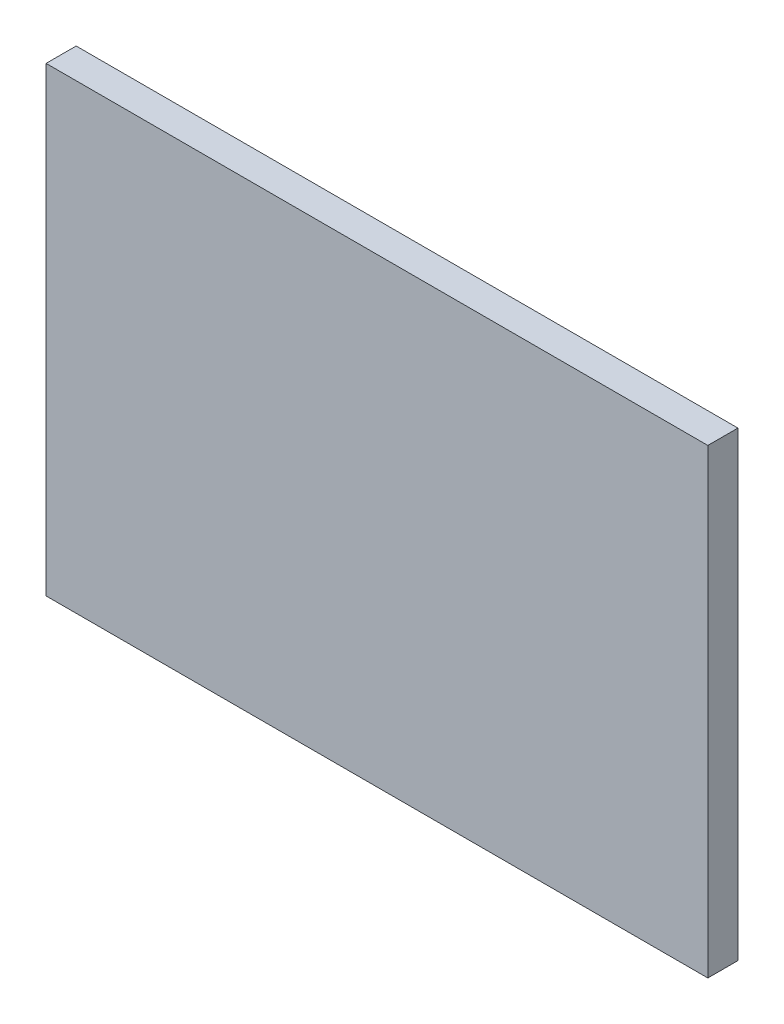
ISO-10303-21;
HEADER;
FILE_DESCRIPTION(('STEP AP214'),'2;1');
FILE_NAME('part.step','',(''),(''),'','','');
FILE_SCHEMA(('AUTOMOTIVE_DESIGN { 1 0 10303 214 1 1 1 1 }'));
ENDSEC;
DATA;
#1=APPLICATION_CONTEXT('core data for automotive mechanical design processes');
#2=APPLICATION_PROTOCOL_DEFINITION('international standard','automotive_design',2000,#1);
#3=PRODUCT_CONTEXT('',#1,'mechanical');
#4=PRODUCT('Part','Part','',(#3));
#5=PRODUCT_RELATED_PRODUCT_CATEGORY('part','',(#4));
#6=PRODUCT_DEFINITION_FORMATION('','',#4);
#7=PRODUCT_DEFINITION_CONTEXT('part definition',#1,'design');
#8=PRODUCT_DEFINITION('design','',#6,#7);
#9=PRODUCT_DEFINITION_SHAPE('','',#8);
#10=(LENGTH_UNIT() NAMED_UNIT(*) SI_UNIT(.MILLI.,.METRE.));
#11=(NAMED_UNIT(*) PLANE_ANGLE_UNIT() SI_UNIT($,.RADIAN.));
#12=(NAMED_UNIT(*) SI_UNIT($,.STERADIAN.) SOLID_ANGLE_UNIT());
#13=UNCERTAINTY_MEASURE_WITH_UNIT(LENGTH_MEASURE(1.E-05),#10,'distance_accuracy_value','');
#14=(GEOMETRIC_REPRESENTATION_CONTEXT(3) GLOBAL_UNCERTAINTY_ASSIGNED_CONTEXT((#13)) GLOBAL_UNIT_ASSIGNED_CONTEXT((#10,
#11,#12)) REPRESENTATION_CONTEXT('',''));
#15=CARTESIAN_POINT('',(0.,0.,0.));
#16=DIRECTION('',(0.,0.,1.));
#17=DIRECTION('',(1.,0.,0.));
#18=AXIS2_PLACEMENT_3D('',#15,#16,#17);
#19=CARTESIAN_POINT('',(32.9999999999999,23.,3.));
#20=DIRECTION('',(-1.,0.,0.));
#21=DIRECTION('',(0.,0.,1.));
#22=AXIS2_PLACEMENT_3D('',#19,#20,#21);
#23=PLANE('',#22);
#24=DIRECTION('',(0.,1.,0.));
#25=VECTOR('',#24,1.);
#26=CARTESIAN_POINT('',(32.9999999999999,23.,0.));
#27=LINE('',#26,#25);
#28=CARTESIAN_POINT('',(32.9999999999999,-23.,0.));
#29=VERTEX_POINT('',#28);
#30=CARTESIAN_POINT('',(32.9999999999999,23.,0.));
#31=VERTEX_POINT('',#30);
#32=EDGE_CURVE('E96',#29,#31,#27,.T.);
#33=ORIENTED_EDGE('',*,*,#32,.T.);
#34=DIRECTION('',(0.,0.,-1.));
#35=VECTOR('',#34,1.);
#36=CARTESIAN_POINT('',(32.9999999999999,23.,3.));
#37=LINE('',#36,#35);
#38=CARTESIAN_POINT('',(32.9999999999999,23.,3.));
#39=VERTEX_POINT('',#38);
#40=EDGE_CURVE('E11',#39,#31,#37,.T.);
#41=ORIENTED_EDGE('',*,*,#40,.F.);
#42=DIRECTION('',(0.,1.,0.));
#43=VECTOR('',#42,1.);
#44=CARTESIAN_POINT('',(32.9999999999999,23.,3.));
#45=LINE('',#44,#43);
#46=CARTESIAN_POINT('',(32.9999999999999,-23.,3.));
#47=VERTEX_POINT('',#46);
#48=EDGE_CURVE('E84',#47,#39,#45,.T.);
#49=ORIENTED_EDGE('',*,*,#48,.F.);
#50=DIRECTION('',(0.,0.,-1.));
#51=VECTOR('',#50,1.);
#52=CARTESIAN_POINT('',(32.9999999999999,-23.,3.));
#53=LINE('',#52,#51);
#54=EDGE_CURVE('E92',#47,#29,#53,.T.);
#55=ORIENTED_EDGE('',*,*,#54,.T.);
#56=EDGE_LOOP('',(#33,#41,#49,#55));
#57=FACE_BOUND('',#56,.T.);
#58=ADVANCED_FACE('F33',(#57),#23,.F.);
#59=CARTESIAN_POINT('',(-33.0000000000001,23.,3.));
#60=DIRECTION('',(0.,-1.,0.));
#61=DIRECTION('',(0.,0.,-1.));
#62=AXIS2_PLACEMENT_3D('',#59,#60,#61);
#63=PLANE('',#62);
#64=DIRECTION('',(-1.,0.,0.));
#65=VECTOR('',#64,1.);
#66=CARTESIAN_POINT('',(-33.0000000000001,23.,0.));
#67=LINE('',#66,#65);
#68=CARTESIAN_POINT('',(-33.0000000000001,23.,0.));
#69=VERTEX_POINT('',#68);
#70=EDGE_CURVE('E88',#31,#69,#67,.T.);
#71=ORIENTED_EDGE('',*,*,#70,.T.);
#72=DIRECTION('',(0.,0.,-1.));
#73=VECTOR('',#72,1.);
#74=CARTESIAN_POINT('',(-33.0000000000001,23.,3.));
#75=LINE('',#74,#73);
#76=CARTESIAN_POINT('',(-33.0000000000001,23.,3.));
#77=VERTEX_POINT('',#76);
#78=EDGE_CURVE('E41',#77,#69,#75,.T.);
#79=ORIENTED_EDGE('',*,*,#78,.F.);
#80=DIRECTION('',(-1.,0.,0.));
#81=VECTOR('',#80,1.);
#82=CARTESIAN_POINT('',(-33.0000000000001,23.,3.));
#83=LINE('',#82,#81);
#84=EDGE_CURVE('E79',#39,#77,#83,.T.);
#85=ORIENTED_EDGE('',*,*,#84,.F.);
#86=ORIENTED_EDGE('',*,*,#40,.T.);
#87=EDGE_LOOP('',(#71,#79,#85,#86));
#88=FACE_BOUND('',#87,.T.);
#89=ADVANCED_FACE('F87',(#88),#63,.F.);
#90=CARTESIAN_POINT('',(-33.0000000000001,23.,3.));
#91=DIRECTION('',(1.,0.,0.));
#92=DIRECTION('',(0.,0.,-1.));
#93=AXIS2_PLACEMENT_3D('',#90,#91,#92);
#94=PLANE('',#93);
#95=DIRECTION('',(0.,-1.,0.));
#96=VECTOR('',#95,1.);
#97=CARTESIAN_POINT('',(-33.0000000000001,23.,0.));
#98=LINE('',#97,#96);
#99=CARTESIAN_POINT('',(-33.0000000000001,-23.,0.));
#100=VERTEX_POINT('',#99);
#101=EDGE_CURVE('E66',#69,#100,#98,.T.);
#102=ORIENTED_EDGE('',*,*,#101,.T.);
#103=DIRECTION('',(0.,0.,-1.));
#104=VECTOR('',#103,1.);
#105=CARTESIAN_POINT('',(-33.0000000000001,-23.,3.));
#106=LINE('',#105,#104);
#107=CARTESIAN_POINT('',(-33.0000000000001,-23.,3.));
#108=VERTEX_POINT('',#107);
#109=EDGE_CURVE('E89',#108,#100,#106,.T.);
#110=ORIENTED_EDGE('',*,*,#109,.F.);
#111=DIRECTION('',(0.,-1.,0.));
#112=VECTOR('',#111,1.);
#113=CARTESIAN_POINT('',(-33.0000000000001,23.,3.));
#114=LINE('',#113,#112);
#115=EDGE_CURVE('E82',#77,#108,#114,.T.);
#116=ORIENTED_EDGE('',*,*,#115,.F.);
#117=ORIENTED_EDGE('',*,*,#78,.T.);
#118=EDGE_LOOP('',(#102,#110,#116,#117));
#119=FACE_BOUND('',#118,.T.);
#120=ADVANCED_FACE('F90',(#119),#94,.F.);
#121=CARTESIAN_POINT('',(-33.0000000000001,-23.,3.));
#122=DIRECTION('',(0.,1.,0.));
#123=DIRECTION('',(0.,0.,1.));
#124=AXIS2_PLACEMENT_3D('',#121,#122,#123);
#125=PLANE('',#124);
#126=DIRECTION('',(1.,0.,0.));
#127=VECTOR('',#126,1.);
#128=CARTESIAN_POINT('',(-33.0000000000001,-23.,0.));
#129=LINE('',#128,#127);
#130=EDGE_CURVE('E72',#100,#29,#129,.T.);
#131=ORIENTED_EDGE('',*,*,#130,.T.);
#132=ORIENTED_EDGE('',*,*,#54,.F.);
#133=DIRECTION('',(1.,0.,0.));
#134=VECTOR('',#133,1.);
#135=CARTESIAN_POINT('',(-33.0000000000001,-23.,3.));
#136=LINE('',#135,#134);
#137=EDGE_CURVE('E49',#108,#47,#136,.T.);
#138=ORIENTED_EDGE('',*,*,#137,.F.);
#139=ORIENTED_EDGE('',*,*,#109,.T.);
#140=EDGE_LOOP('',(#131,#132,#138,#139));
#141=FACE_BOUND('',#140,.T.);
#142=ADVANCED_FACE('F103',(#141),#125,.F.);
#143=CARTESIAN_POINT('',(0.,0.,3.));
#144=DIRECTION('',(0.,0.,1.));
#145=DIRECTION('',(1.,0.,0.));
#146=AXIS2_PLACEMENT_3D('',#143,#144,#145);
#147=PLANE('',#146);
#148=ORIENTED_EDGE('',*,*,#48,.T.);
#149=ORIENTED_EDGE('',*,*,#84,.T.);
#150=ORIENTED_EDGE('',*,*,#115,.T.);
#151=ORIENTED_EDGE('',*,*,#137,.T.);
#152=EDGE_LOOP('',(#148,#149,#150,#151));
#153=FACE_BOUND('',#152,.T.);
#154=ADVANCED_FACE('F80',(#153),#147,.T.);
#155=CARTESIAN_POINT('',(0.,0.,0.));
#156=DIRECTION('',(0.,0.,1.));
#157=DIRECTION('',(1.,0.,0.));
#158=AXIS2_PLACEMENT_3D('',#155,#156,#157);
#159=PLANE('',#158);
#160=ORIENTED_EDGE('',*,*,#32,.F.);
#161=ORIENTED_EDGE('',*,*,#130,.F.);
#162=ORIENTED_EDGE('',*,*,#101,.F.);
#163=ORIENTED_EDGE('',*,*,#70,.F.);
#164=EDGE_LOOP('',(#160,#161,#162,#163));
#165=FACE_BOUND('',#164,.T.);
#166=ADVANCED_FACE('F106',(#165),#159,.F.);
#167=CLOSED_SHELL('',(#58,#89,#120,#142,#154,#166));
#168=MANIFOLD_SOLID_BREP('B2',#167);
#169=ADVANCED_BREP_SHAPE_REPRESENTATION('',(#18,#168),#14);
#170=SHAPE_DEFINITION_REPRESENTATION(#9,#169);
ENDSEC;
END-ISO-10303-21;
